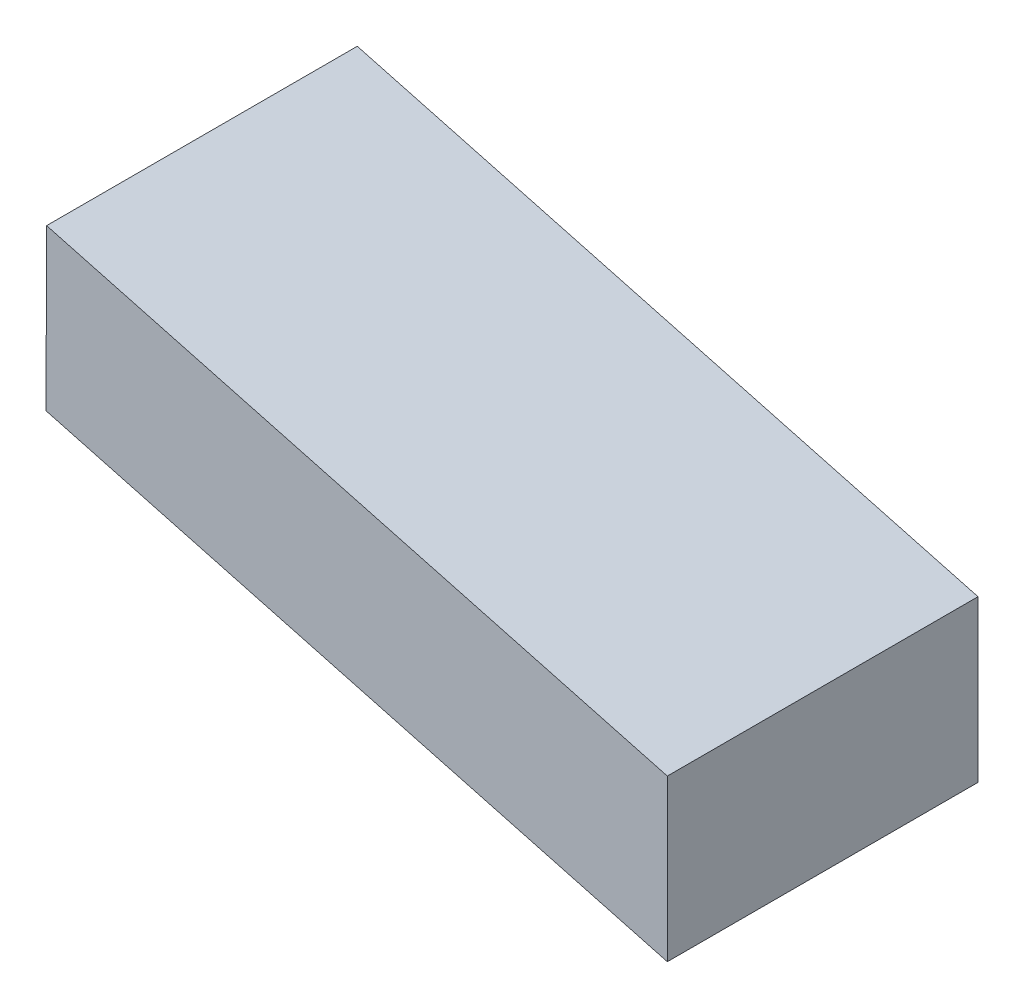
ISO-10303-21;
HEADER;
FILE_DESCRIPTION(('STEP AP214'),'2;1');
FILE_NAME('part.step','',(''),(''),'','','');
FILE_SCHEMA(('AUTOMOTIVE_DESIGN { 1 0 10303 214 1 1 1 1 }'));
ENDSEC;
DATA;
#1=APPLICATION_CONTEXT('core data for automotive mechanical design processes');
#2=APPLICATION_PROTOCOL_DEFINITION('international standard','automotive_design',2000,#1);
#3=PRODUCT_CONTEXT('',#1,'mechanical');
#4=PRODUCT('Part','Part','',(#3));
#5=PRODUCT_RELATED_PRODUCT_CATEGORY('part','',(#4));
#6=PRODUCT_DEFINITION_FORMATION('','',#4);
#7=PRODUCT_DEFINITION_CONTEXT('part definition',#1,'design');
#8=PRODUCT_DEFINITION('design','',#6,#7);
#9=PRODUCT_DEFINITION_SHAPE('','',#8);
#10=(LENGTH_UNIT() NAMED_UNIT(*) SI_UNIT(.MILLI.,.METRE.));
#11=(NAMED_UNIT(*) PLANE_ANGLE_UNIT() SI_UNIT($,.RADIAN.));
#12=(NAMED_UNIT(*) SI_UNIT($,.STERADIAN.) SOLID_ANGLE_UNIT());
#13=UNCERTAINTY_MEASURE_WITH_UNIT(LENGTH_MEASURE(1.E-05),#10,'distance_accuracy_value','');
#14=(GEOMETRIC_REPRESENTATION_CONTEXT(3) GLOBAL_UNCERTAINTY_ASSIGNED_CONTEXT((#13)) GLOBAL_UNIT_ASSIGNED_CONTEXT((#10,
#11,#12)) REPRESENTATION_CONTEXT('',''));
#15=CARTESIAN_POINT('',(0.,0.,0.));
#16=DIRECTION('',(0.,0.,1.));
#17=DIRECTION('',(1.,0.,0.));
#18=AXIS2_PLACEMENT_3D('',#15,#16,#17);
#19=CARTESIAN_POINT('',(0.,0.,-10.));
#20=DIRECTION('',(-0.258819045102521,-0.965925826289068,0.));
#21=DIRECTION('',(0.965925826289068,-0.258819045102521,0.));
#22=AXIS2_PLACEMENT_3D('',#19,#20,#21);
#23=PLANE('',#22);
#24=DIRECTION('',(0.965925826289068,-0.258819045102521,0.));
#25=VECTOR('',#24,1.);
#26=CARTESIAN_POINT('',(0.,0.,0.));
#27=LINE('',#26,#25);
#28=CARTESIAN_POINT('',(-20.,5.35898384862247,0.));
#29=VERTEX_POINT('',#28);
#30=CARTESIAN_POINT('',(0.,0.,0.));
#31=VERTEX_POINT('',#30);
#32=EDGE_CURVE('E99',#29,#31,#27,.T.);
#33=ORIENTED_EDGE('',*,*,#32,.F.);
#34=DIRECTION('',(0.,0.,1.));
#35=VECTOR('',#34,1.);
#36=CARTESIAN_POINT('',(-20.,5.35898384862247,-10.));
#37=LINE('',#36,#35);
#38=CARTESIAN_POINT('',(-20.,5.35898384862247,-10.));
#39=VERTEX_POINT('',#38);
#40=EDGE_CURVE('E11',#39,#29,#37,.T.);
#41=ORIENTED_EDGE('',*,*,#40,.F.);
#42=DIRECTION('',(0.965925826289068,-0.258819045102521,0.));
#43=VECTOR('',#42,1.);
#44=CARTESIAN_POINT('',(0.,0.,-10.));
#45=LINE('',#44,#43);
#46=CARTESIAN_POINT('',(0.,0.,-10.));
#47=VERTEX_POINT('',#46);
#48=EDGE_CURVE('E93',#39,#47,#45,.T.);
#49=ORIENTED_EDGE('',*,*,#48,.T.);
#50=DIRECTION('',(0.,0.,1.));
#51=VECTOR('',#50,1.);
#52=CARTESIAN_POINT('',(0.,0.,-10.));
#53=LINE('',#52,#51);
#54=EDGE_CURVE('E38',#47,#31,#53,.T.);
#55=ORIENTED_EDGE('',*,*,#54,.T.);
#56=EDGE_LOOP('',(#33,#41,#49,#55));
#57=FACE_BOUND('',#56,.T.);
#58=ADVANCED_FACE('F35',(#57),#23,.T.);
#59=CARTESIAN_POINT('',(-19.9803267461353,10.5300933181874,-10.));
#60=DIRECTION('',(-0.999992763139203,0.00380442758132568,0.));
#61=DIRECTION('',(-0.00380442758132568,-0.999992763139203,0.));
#62=AXIS2_PLACEMENT_3D('',#59,#60,#61);
#63=PLANE('',#62);
#64=DIRECTION('',(-0.00380442758132568,-0.999992763139203,0.));
#65=VECTOR('',#64,1.);
#66=CARTESIAN_POINT('',(-19.9803267461353,10.5300933181874,0.));
#67=LINE('',#66,#65);
#68=CARTESIAN_POINT('',(-19.9803267461353,10.5300933181874,0.));
#69=VERTEX_POINT('',#68);
#70=EDGE_CURVE('E95',#69,#29,#67,.T.);
#71=ORIENTED_EDGE('',*,*,#70,.F.);
#72=DIRECTION('',(0.,0.,1.));
#73=VECTOR('',#72,1.);
#74=CARTESIAN_POINT('',(-19.9803267461353,10.5300933181874,-10.));
#75=LINE('',#74,#73);
#76=CARTESIAN_POINT('',(-19.9803267461353,10.5300933181874,-10.));
#77=VERTEX_POINT('',#76);
#78=EDGE_CURVE('E44',#77,#69,#75,.T.);
#79=ORIENTED_EDGE('',*,*,#78,.F.);
#80=DIRECTION('',(-0.00380442758132568,-0.999992763139203,0.));
#81=VECTOR('',#80,1.);
#82=CARTESIAN_POINT('',(-19.9803267461353,10.5300933181874,-10.));
#83=LINE('',#82,#81);
#84=EDGE_CURVE('E90',#77,#39,#83,.T.);
#85=ORIENTED_EDGE('',*,*,#84,.T.);
#86=ORIENTED_EDGE('',*,*,#40,.T.);
#87=EDGE_LOOP('',(#71,#79,#85,#86));
#88=FACE_BOUND('',#87,.T.);
#89=ADVANCED_FACE('F109',(#88),#63,.T.);
#90=CARTESIAN_POINT('',(0.,5.17638090205041,-10.));
#91=DIRECTION('',(0.258819045102521,0.965925826289068,0.));
#92=DIRECTION('',(-0.965925826289068,0.258819045102521,0.));
#93=AXIS2_PLACEMENT_3D('',#90,#91,#92);
#94=PLANE('',#93);
#95=DIRECTION('',(-0.965925826289068,0.258819045102521,0.));
#96=VECTOR('',#95,1.);
#97=CARTESIAN_POINT('',(0.,5.17638090205041,0.));
#98=LINE('',#97,#96);
#99=CARTESIAN_POINT('',(0.,5.17638090205041,0.));
#100=VERTEX_POINT('',#99);
#101=EDGE_CURVE('E85',#100,#69,#98,.T.);
#102=ORIENTED_EDGE('',*,*,#101,.F.);
#103=DIRECTION('',(0.,0.,1.));
#104=VECTOR('',#103,1.);
#105=CARTESIAN_POINT('',(0.,5.17638090205041,-10.));
#106=LINE('',#105,#104);
#107=CARTESIAN_POINT('',(0.,5.17638090205041,-10.));
#108=VERTEX_POINT('',#107);
#109=EDGE_CURVE('E80',#108,#100,#106,.T.);
#110=ORIENTED_EDGE('',*,*,#109,.F.);
#111=DIRECTION('',(-0.965925826289068,0.258819045102521,0.));
#112=VECTOR('',#111,1.);
#113=CARTESIAN_POINT('',(0.,5.17638090205041,-10.));
#114=LINE('',#113,#112);
#115=EDGE_CURVE('E83',#108,#77,#114,.T.);
#116=ORIENTED_EDGE('',*,*,#115,.T.);
#117=ORIENTED_EDGE('',*,*,#78,.T.);
#118=EDGE_LOOP('',(#102,#110,#116,#117));
#119=FACE_BOUND('',#118,.T.);
#120=ADVANCED_FACE('F82',(#119),#94,.T.);
#121=CARTESIAN_POINT('',(0.,0.,-10.));
#122=DIRECTION('',(1.,0.,0.));
#123=DIRECTION('',(0.,1.,0.));
#124=AXIS2_PLACEMENT_3D('',#121,#122,#123);
#125=PLANE('',#124);
#126=DIRECTION('',(0.,1.,0.));
#127=VECTOR('',#126,1.);
#128=CARTESIAN_POINT('',(0.,0.,0.));
#129=LINE('',#128,#127);
#130=EDGE_CURVE('E102',#31,#100,#129,.T.);
#131=ORIENTED_EDGE('',*,*,#130,.F.);
#132=ORIENTED_EDGE('',*,*,#54,.F.);
#133=DIRECTION('',(0.,1.,0.));
#134=VECTOR('',#133,1.);
#135=CARTESIAN_POINT('',(0.,0.,-10.));
#136=LINE('',#135,#134);
#137=EDGE_CURVE('E89',#47,#108,#136,.T.);
#138=ORIENTED_EDGE('',*,*,#137,.T.);
#139=ORIENTED_EDGE('',*,*,#109,.T.);
#140=EDGE_LOOP('',(#131,#132,#138,#139));
#141=FACE_BOUND('',#140,.T.);
#142=ADVANCED_FACE('F92',(#141),#125,.T.);
#143=CARTESIAN_POINT('',(0.,0.,-10.));
#144=DIRECTION('',(0.,0.,1.));
#145=DIRECTION('',(1.,0.,0.));
#146=AXIS2_PLACEMENT_3D('',#143,#144,#145);
#147=PLANE('',#146);
#148=ORIENTED_EDGE('',*,*,#48,.F.);
#149=ORIENTED_EDGE('',*,*,#84,.F.);
#150=ORIENTED_EDGE('',*,*,#115,.F.);
#151=ORIENTED_EDGE('',*,*,#137,.F.);
#152=EDGE_LOOP('',(#148,#149,#150,#151));
#153=FACE_BOUND('',#152,.T.);
#154=ADVANCED_FACE('F88',(#153),#147,.F.);
#155=CARTESIAN_POINT('',(0.,0.,0.));
#156=DIRECTION('',(0.,0.,1.));
#157=DIRECTION('',(1.,0.,0.));
#158=AXIS2_PLACEMENT_3D('',#155,#156,#157);
#159=PLANE('',#158);
#160=ORIENTED_EDGE('',*,*,#32,.T.);
#161=ORIENTED_EDGE('',*,*,#130,.T.);
#162=ORIENTED_EDGE('',*,*,#101,.T.);
#163=ORIENTED_EDGE('',*,*,#70,.T.);
#164=EDGE_LOOP('',(#160,#161,#162,#163));
#165=FACE_BOUND('',#164,.T.);
#166=ADVANCED_FACE('F108',(#165),#159,.T.);
#167=CLOSED_SHELL('',(#58,#89,#120,#142,#154,#166));
#168=MANIFOLD_SOLID_BREP('B2',#167);
#169=ADVANCED_BREP_SHAPE_REPRESENTATION('',(#18,#168),#14);
#170=SHAPE_DEFINITION_REPRESENTATION(#9,#169);
ENDSEC;
END-ISO-10303-21;
